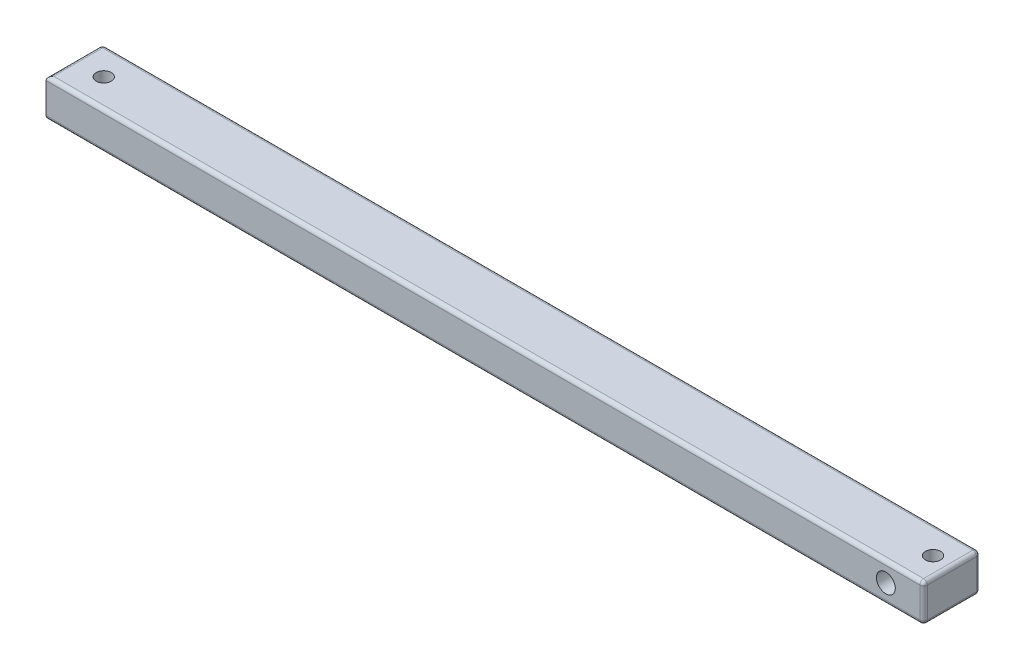
ISO-10303-21;
HEADER;
FILE_DESCRIPTION(('STEP AP214'),'2;1');
FILE_NAME('part.step','',(''),(''),'','','');
FILE_SCHEMA(('AUTOMOTIVE_DESIGN { 1 0 10303 214 1 1 1 1 }'));
ENDSEC;
DATA;
#1=APPLICATION_CONTEXT('core data for automotive mechanical design processes');
#2=APPLICATION_PROTOCOL_DEFINITION('international standard','automotive_design',2000,#1);
#3=PRODUCT_CONTEXT('',#1,'mechanical');
#4=PRODUCT('Part','Part','',(#3));
#5=PRODUCT_RELATED_PRODUCT_CATEGORY('part','',(#4));
#6=PRODUCT_DEFINITION_FORMATION('','',#4);
#7=PRODUCT_DEFINITION_CONTEXT('part definition',#1,'design');
#8=PRODUCT_DEFINITION('design','',#6,#7);
#9=PRODUCT_DEFINITION_SHAPE('','',#8);
#10=(LENGTH_UNIT() NAMED_UNIT(*) SI_UNIT(.MILLI.,.METRE.));
#11=(NAMED_UNIT(*) PLANE_ANGLE_UNIT() SI_UNIT($,.RADIAN.));
#12=(NAMED_UNIT(*) SI_UNIT($,.STERADIAN.) SOLID_ANGLE_UNIT());
#13=UNCERTAINTY_MEASURE_WITH_UNIT(LENGTH_MEASURE(1.E-05),#10,'distance_accuracy_value','');
#14=(GEOMETRIC_REPRESENTATION_CONTEXT(3) GLOBAL_UNCERTAINTY_ASSIGNED_CONTEXT((#13)) GLOBAL_UNIT_ASSIGNED_CONTEXT((#10,
#11,#12)) REPRESENTATION_CONTEXT('',''));
#15=CARTESIAN_POINT('',(0.,0.,0.));
#16=DIRECTION('',(0.,0.,1.));
#17=DIRECTION('',(1.,0.,0.));
#18=AXIS2_PLACEMENT_3D('',#15,#16,#17);
#19=CARTESIAN_POINT('',(-232.5,20.,30.));
#20=DIRECTION('',(1.,0.,0.));
#21=DIRECTION('',(0.,1.,0.));
#22=AXIS2_PLACEMENT_3D('',#19,#20,#21);
#23=PLANE('',#22);
#24=DIRECTION('',(0.,-1.,0.));
#25=VECTOR('',#24,1.);
#26=CARTESIAN_POINT('',(-232.5,20.,30.));
#27=LINE('',#26,#25);
#28=CARTESIAN_POINT('',(-232.5,18.,30.));
#29=VERTEX_POINT('',#28);
#30=CARTESIAN_POINT('',(-232.5,2.,30.));
#31=VERTEX_POINT('',#30);
#32=EDGE_CURVE('E143',#29,#31,#27,.T.);
#33=ORIENTED_EDGE('',*,*,#32,.F.);
#34=DIRECTION('',(0.,0.,-1.));
#35=VECTOR('',#34,1.);
#36=CARTESIAN_POINT('',(-232.5,18.,30.));
#37=LINE('',#36,#35);
#38=CARTESIAN_POINT('',(-232.5,18.,2.));
#39=VERTEX_POINT('',#38);
#40=EDGE_CURVE('E232',#29,#39,#37,.T.);
#41=ORIENTED_EDGE('',*,*,#40,.T.);
#42=DIRECTION('',(0.,-1.,0.));
#43=VECTOR('',#42,1.);
#44=CARTESIAN_POINT('',(-232.5,20.,2.));
#45=LINE('',#44,#43);
#46=CARTESIAN_POINT('',(-232.5,2.,2.));
#47=VERTEX_POINT('',#46);
#48=EDGE_CURVE('E229',#39,#47,#45,.T.);
#49=ORIENTED_EDGE('',*,*,#48,.T.);
#50=DIRECTION('',(0.,0.,-1.));
#51=VECTOR('',#50,1.);
#52=CARTESIAN_POINT('',(-232.5,2.,30.));
#53=LINE('',#52,#51);
#54=EDGE_CURVE('E227',#47,#31,#53,.F.);
#55=ORIENTED_EDGE('',*,*,#54,.T.);
#56=EDGE_LOOP('',(#33,#41,#49,#55));
#57=FACE_BOUND('',#56,.T.);
#58=ADVANCED_FACE('F41',(#57),#23,.F.);
#59=CARTESIAN_POINT('',(-232.5,0.,30.));
#60=DIRECTION('',(0.,1.,0.));
#61=DIRECTION('',(0.,0.,1.));
#62=AXIS2_PLACEMENT_3D('',#59,#60,#61);
#63=PLANE('',#62);
#64=CARTESIAN_POINT('',(222.5,0.,15.));
#65=DIRECTION('',(0.,1.,0.));
#66=DIRECTION('',(0.,0.,1.));
#67=AXIS2_PLACEMENT_3D('',#64,#65,#66);
#68=CIRCLE('',#67,3.99999999999999);
#69=CARTESIAN_POINT('',(222.5,0.,19.));
#70=VERTEX_POINT('',#69);
#71=EDGE_CURVE('E579',#70,#70,#68,.T.);
#72=ORIENTED_EDGE('',*,*,#71,.T.);
#73=EDGE_LOOP('',(#72));
#74=FACE_BOUND('',#73,.T.);
#75=CARTESIAN_POINT('',(-216.9,0.,15.));
#76=DIRECTION('',(0.,1.,0.));
#77=DIRECTION('',(0.,0.,1.));
#78=AXIS2_PLACEMENT_3D('',#75,#76,#77);
#79=CIRCLE('',#78,3.99999999999999);
#80=CARTESIAN_POINT('',(-216.9,0.,19.));
#81=VERTEX_POINT('',#80);
#82=EDGE_CURVE('E240',#81,#81,#79,.T.);
#83=ORIENTED_EDGE('',*,*,#82,.T.);
#84=EDGE_LOOP('',(#83));
#85=FACE_BOUND('',#84,.T.);
#86=DIRECTION('',(0.,0.,-1.));
#87=VECTOR('',#86,1.);
#88=CARTESIAN_POINT('',(-230.5,0.,30.));
#89=LINE('',#88,#87);
#90=CARTESIAN_POINT('',(-230.5,0.,28.));
#91=VERTEX_POINT('',#90);
#92=CARTESIAN_POINT('',(-230.5,0.,2.));
#93=VERTEX_POINT('',#92);
#94=EDGE_CURVE('E132',#91,#93,#89,.T.);
#95=ORIENTED_EDGE('',*,*,#94,.T.);
#96=DIRECTION('',(1.,0.,0.));
#97=VECTOR('',#96,1.);
#98=CARTESIAN_POINT('',(-232.5,0.,2.));
#99=LINE('',#98,#97);
#100=CARTESIAN_POINT('',(230.5,0.,2.));
#101=VERTEX_POINT('',#100);
#102=EDGE_CURVE('E128',#93,#101,#99,.T.);
#103=ORIENTED_EDGE('',*,*,#102,.T.);
#104=DIRECTION('',(0.,0.,-1.));
#105=VECTOR('',#104,1.);
#106=CARTESIAN_POINT('',(230.5,0.,30.));
#107=LINE('',#106,#105);
#108=CARTESIAN_POINT('',(230.5,0.,28.));
#109=VERTEX_POINT('',#108);
#110=EDGE_CURVE('E122',#101,#109,#107,.F.);
#111=ORIENTED_EDGE('',*,*,#110,.T.);
#112=DIRECTION('',(1.,0.,0.));
#113=VECTOR('',#112,1.);
#114=CARTESIAN_POINT('',(-232.5,0.,28.));
#115=LINE('',#114,#113);
#116=EDGE_CURVE('E125',#109,#91,#115,.F.);
#117=ORIENTED_EDGE('',*,*,#116,.T.);
#118=EDGE_LOOP('',(#95,#103,#111,#117));
#119=FACE_BOUND('',#118,.T.);
#120=ADVANCED_FACE('F124',(#74,#85,#119),#63,.F.);
#121=CARTESIAN_POINT('',(232.5,0.,30.));
#122=DIRECTION('',(-1.,0.,0.));
#123=DIRECTION('',(0.,-1.,0.));
#124=AXIS2_PLACEMENT_3D('',#121,#122,#123);
#125=PLANE('',#124);
#126=DIRECTION('',(0.,0.,-1.));
#127=VECTOR('',#126,1.);
#128=CARTESIAN_POINT('',(232.5,2.,30.));
#129=LINE('',#128,#127);
#130=CARTESIAN_POINT('',(232.5,2.,28.));
#131=VERTEX_POINT('',#130);
#132=CARTESIAN_POINT('',(232.5,2.,2.));
#133=VERTEX_POINT('',#132);
#134=EDGE_CURVE('E155',#131,#133,#129,.T.);
#135=ORIENTED_EDGE('',*,*,#134,.T.);
#136=DIRECTION('',(0.,1.,0.));
#137=VECTOR('',#136,1.);
#138=CARTESIAN_POINT('',(232.5,0.,2.));
#139=LINE('',#138,#137);
#140=CARTESIAN_POINT('',(232.5,18.,2.));
#141=VERTEX_POINT('',#140);
#142=EDGE_CURVE('E215',#133,#141,#139,.T.);
#143=ORIENTED_EDGE('',*,*,#142,.T.);
#144=DIRECTION('',(0.,0.,-1.));
#145=VECTOR('',#144,1.);
#146=CARTESIAN_POINT('',(232.5,18.,30.));
#147=LINE('',#146,#145);
#148=CARTESIAN_POINT('',(232.5,18.,28.));
#149=VERTEX_POINT('',#148);
#150=EDGE_CURVE('E213',#141,#149,#147,.F.);
#151=ORIENTED_EDGE('',*,*,#150,.T.);
#152=DIRECTION('',(0.,1.,0.));
#153=VECTOR('',#152,1.);
#154=CARTESIAN_POINT('',(232.5,0.,28.));
#155=LINE('',#154,#153);
#156=EDGE_CURVE('E210',#149,#131,#155,.F.);
#157=ORIENTED_EDGE('',*,*,#156,.T.);
#158=EDGE_LOOP('',(#135,#143,#151,#157));
#159=FACE_BOUND('',#158,.T.);
#160=ADVANCED_FACE('F277',(#159),#125,.F.);
#161=CARTESIAN_POINT('',(232.5,20.,30.));
#162=DIRECTION('',(0.,-1.,0.));
#163=DIRECTION('',(0.,0.,-1.));
#164=AXIS2_PLACEMENT_3D('',#161,#162,#163);
#165=PLANE('',#164);
#166=CARTESIAN_POINT('',(222.5,20.,15.));
#167=DIRECTION('',(0.,1.,0.));
#168=DIRECTION('',(0.,0.,1.));
#169=AXIS2_PLACEMENT_3D('',#166,#167,#168);
#170=CIRCLE('',#169,3.99999999999999);
#171=CARTESIAN_POINT('',(222.5,20.,19.));
#172=VERTEX_POINT('',#171);
#173=EDGE_CURVE('E584',#172,#172,#170,.T.);
#174=ORIENTED_EDGE('',*,*,#173,.F.);
#175=EDGE_LOOP('',(#174));
#176=FACE_BOUND('',#175,.T.);
#177=CARTESIAN_POINT('',(-216.9,20.,15.));
#178=DIRECTION('',(0.,1.,0.));
#179=DIRECTION('',(0.,0.,1.));
#180=AXIS2_PLACEMENT_3D('',#177,#178,#179);
#181=CIRCLE('',#180,3.99999999999999);
#182=CARTESIAN_POINT('',(-216.9,20.,19.));
#183=VERTEX_POINT('',#182);
#184=EDGE_CURVE('E196',#183,#183,#181,.T.);
#185=ORIENTED_EDGE('',*,*,#184,.F.);
#186=EDGE_LOOP('',(#185));
#187=FACE_BOUND('',#186,.T.);
#188=DIRECTION('',(0.,0.,-1.));
#189=VECTOR('',#188,1.);
#190=CARTESIAN_POINT('',(230.5,20.,30.));
#191=LINE('',#190,#189);
#192=CARTESIAN_POINT('',(230.5,20.,28.));
#193=VERTEX_POINT('',#192);
#194=CARTESIAN_POINT('',(230.5,20.,2.));
#195=VERTEX_POINT('',#194);
#196=EDGE_CURVE('E220',#193,#195,#191,.T.);
#197=ORIENTED_EDGE('',*,*,#196,.T.);
#198=DIRECTION('',(-1.,0.,0.));
#199=VECTOR('',#198,1.);
#200=CARTESIAN_POINT('',(232.5,20.,2.));
#201=LINE('',#200,#199);
#202=CARTESIAN_POINT('',(-230.5,20.,2.));
#203=VERTEX_POINT('',#202);
#204=EDGE_CURVE('E224',#195,#203,#201,.T.);
#205=ORIENTED_EDGE('',*,*,#204,.T.);
#206=DIRECTION('',(0.,0.,-1.));
#207=VECTOR('',#206,1.);
#208=CARTESIAN_POINT('',(-230.5,20.,30.));
#209=LINE('',#208,#207);
#210=CARTESIAN_POINT('',(-230.5,20.,28.));
#211=VERTEX_POINT('',#210);
#212=EDGE_CURVE('E222',#203,#211,#209,.F.);
#213=ORIENTED_EDGE('',*,*,#212,.T.);
#214=DIRECTION('',(-1.,0.,0.));
#215=VECTOR('',#214,1.);
#216=CARTESIAN_POINT('',(232.5,20.,28.));
#217=LINE('',#216,#215);
#218=EDGE_CURVE('E218',#211,#193,#217,.F.);
#219=ORIENTED_EDGE('',*,*,#218,.T.);
#220=EDGE_LOOP('',(#197,#205,#213,#219));
#221=FACE_BOUND('',#220,.T.);
#222=ADVANCED_FACE('F289',(#176,#187,#221),#165,.F.);
#223=CARTESIAN_POINT('',(0.,0.,30.));
#224=DIRECTION('',(0.,0.,1.));
#225=DIRECTION('',(1.,0.,0.));
#226=AXIS2_PLACEMENT_3D('',#223,#224,#225);
#227=PLANE('',#226);
#228=CARTESIAN_POINT('',(212.5,10.,30.));
#229=DIRECTION('',(0.,0.,1.));
#230=DIRECTION('',(1.,0.,0.));
#231=AXIS2_PLACEMENT_3D('',#228,#229,#230);
#232=CIRCLE('',#231,4.99999999999999);
#233=CARTESIAN_POINT('',(217.5,10.,30.));
#234=VERTEX_POINT('',#233);
#235=EDGE_CURVE('E576',#234,#234,#232,.T.);
#236=ORIENTED_EDGE('',*,*,#235,.F.);
#237=EDGE_LOOP('',(#236));
#238=FACE_BOUND('',#237,.T.);
#239=ORIENTED_EDGE('',*,*,#32,.T.);
#240=DIRECTION('',(1.,0.,0.));
#241=VECTOR('',#240,1.);
#242=CARTESIAN_POINT('',(232.5,2.,30.));
#243=LINE('',#242,#241);
#244=CARTESIAN_POINT('',(230.5,2.,30.));
#245=VERTEX_POINT('',#244);
#246=EDGE_CURVE('E11',#31,#245,#243,.T.);
#247=ORIENTED_EDGE('',*,*,#246,.T.);
#248=DIRECTION('',(0.,1.,0.));
#249=VECTOR('',#248,1.);
#250=CARTESIAN_POINT('',(230.5,20.,30.));
#251=LINE('',#250,#249);
#252=CARTESIAN_POINT('',(230.5,18.,30.));
#253=VERTEX_POINT('',#252);
#254=EDGE_CURVE('E50',#245,#253,#251,.T.);
#255=ORIENTED_EDGE('',*,*,#254,.T.);
#256=DIRECTION('',(-1.,0.,0.));
#257=VECTOR('',#256,1.);
#258=CARTESIAN_POINT('',(-232.5,18.,30.));
#259=LINE('',#258,#257);
#260=EDGE_CURVE('E234',#253,#29,#259,.T.);
#261=ORIENTED_EDGE('',*,*,#260,.T.);
#262=EDGE_LOOP('',(#239,#247,#255,#261));
#263=FACE_BOUND('',#262,.T.);
#264=ADVANCED_FACE('F299',(#238,#263),#227,.T.);
#265=CARTESIAN_POINT('',(0.,0.,0.));
#266=DIRECTION('',(0.,0.,1.));
#267=DIRECTION('',(1.,0.,0.));
#268=AXIS2_PLACEMENT_3D('',#265,#266,#267);
#269=PLANE('',#268);
#270=CARTESIAN_POINT('',(212.5,10.,0.));
#271=DIRECTION('',(0.,0.,1.));
#272=DIRECTION('',(1.,0.,0.));
#273=AXIS2_PLACEMENT_3D('',#270,#271,#272);
#274=CIRCLE('',#273,4.99999999999999);
#275=CARTESIAN_POINT('',(217.5,10.,0.));
#276=VERTEX_POINT('',#275);
#277=EDGE_CURVE('E578',#276,#276,#274,.T.);
#278=ORIENTED_EDGE('',*,*,#277,.T.);
#279=EDGE_LOOP('',(#278));
#280=FACE_BOUND('',#279,.T.);
#281=DIRECTION('',(0.,1.,0.));
#282=VECTOR('',#281,1.);
#283=CARTESIAN_POINT('',(230.5,3.19883008970123E-13,0.));
#284=LINE('',#283,#282);
#285=CARTESIAN_POINT('',(230.5,18.,0.));
#286=VERTEX_POINT('',#285);
#287=CARTESIAN_POINT('',(230.5,2.,0.));
#288=VERTEX_POINT('',#287);
#289=EDGE_CURVE('E205',#286,#288,#284,.F.);
#290=ORIENTED_EDGE('',*,*,#289,.T.);
#291=DIRECTION('',(1.,0.,0.));
#292=VECTOR('',#291,1.);
#293=CARTESIAN_POINT('',(0.,2.,0.));
#294=LINE('',#293,#292);
#295=CARTESIAN_POINT('',(-230.5,2.,0.));
#296=VERTEX_POINT('',#295);
#297=EDGE_CURVE('E207',#288,#296,#294,.F.);
#298=ORIENTED_EDGE('',*,*,#297,.T.);
#299=DIRECTION('',(0.,-1.,0.));
#300=VECTOR('',#299,1.);
#301=CARTESIAN_POINT('',(-230.5,3.19883008970123E-13,0.));
#302=LINE('',#301,#300);
#303=CARTESIAN_POINT('',(-230.5,18.,0.));
#304=VERTEX_POINT('',#303);
#305=EDGE_CURVE('E201',#296,#304,#302,.F.);
#306=ORIENTED_EDGE('',*,*,#305,.T.);
#307=DIRECTION('',(-1.,0.,0.));
#308=VECTOR('',#307,1.);
#309=CARTESIAN_POINT('',(0.,18.,0.));
#310=LINE('',#309,#308);
#311=EDGE_CURVE('E203',#304,#286,#310,.F.);
#312=ORIENTED_EDGE('',*,*,#311,.T.);
#313=EDGE_LOOP('',(#290,#298,#306,#312));
#314=FACE_BOUND('',#313,.T.);
#315=ADVANCED_FACE('F264',(#280,#314),#269,.F.);
#316=CARTESIAN_POINT('',(0.,18.,28.));
#317=DIRECTION('',(1.,0.,0.));
#318=DIRECTION('',(0.,0.,-1.));
#319=AXIS2_PLACEMENT_3D('',#316,#317,#318);
#320=CYLINDRICAL_SURFACE('',#319,2.);
#321=CARTESIAN_POINT('',(230.5,18.,28.));
#322=DIRECTION('',(1.,0.,0.));
#323=DIRECTION('',(0.,0.,-1.));
#324=AXIS2_PLACEMENT_3D('',#321,#322,#323);
#325=CIRCLE('',#324,2.);
#326=EDGE_CURVE('E45',#193,#253,#325,.T.);
#327=ORIENTED_EDGE('',*,*,#326,.F.);
#328=ORIENTED_EDGE('',*,*,#218,.F.);
#329=CARTESIAN_POINT('',(-230.5,18.,28.));
#330=DIRECTION('',(0.707106781186547,0.,0.707106781186547));
#331=DIRECTION('',(0.707106781186547,0.,-0.707106781186547));
#332=AXIS2_PLACEMENT_3D('',#329,#330,#331);
#333=ELLIPSE('',#332,2.82842712474619,2.);
#334=EDGE_CURVE('E182',#29,#211,#333,.F.);
#335=ORIENTED_EDGE('',*,*,#334,.F.);
#336=ORIENTED_EDGE('',*,*,#260,.F.);
#337=EDGE_LOOP('',(#327,#328,#335,#336));
#338=FACE_BOUND('',#337,.T.);
#339=ADVANCED_FACE('F43',(#338),#320,.T.);
#340=CARTESIAN_POINT('',(230.5,18.,28.));
#341=DIRECTION('',(0.,0.,1.));
#342=DIRECTION('',(1.,0.,0.));
#343=AXIS2_PLACEMENT_3D('',#340,#341,#342);
#344=SPHERICAL_SURFACE('',#343,2.);
#345=CARTESIAN_POINT('',(230.5,18.,28.));
#346=DIRECTION('',(0.,0.,1.));
#347=DIRECTION('',(1.,0.,0.));
#348=AXIS2_PLACEMENT_3D('',#345,#346,#347);
#349=CIRCLE('',#348,2.);
#350=EDGE_CURVE('E177',#193,#149,#349,.F.);
#351=ORIENTED_EDGE('',*,*,#350,.F.);
#352=ORIENTED_EDGE('',*,*,#326,.T.);
#353=CARTESIAN_POINT('',(230.5,18.,28.));
#354=DIRECTION('',(0.,1.,0.));
#355=DIRECTION('',(-1.,0.,0.));
#356=AXIS2_PLACEMENT_3D('',#353,#354,#355);
#357=CIRCLE('',#356,2.);
#358=EDGE_CURVE('E180',#149,#253,#357,.F.);
#359=ORIENTED_EDGE('',*,*,#358,.F.);
#360=EDGE_LOOP('',(#351,#352,#359));
#361=FACE_BOUND('',#360,.T.);
#362=ADVANCED_FACE('F282',(#361),#344,.T.);
#363=CARTESIAN_POINT('',(-230.5,18.,30.));
#364=DIRECTION('',(0.,0.,-1.));
#365=DIRECTION('',(-1.,0.,0.));
#366=AXIS2_PLACEMENT_3D('',#363,#364,#365);
#367=CYLINDRICAL_SURFACE('',#366,2.);
#368=ORIENTED_EDGE('',*,*,#334,.T.);
#369=ORIENTED_EDGE('',*,*,#212,.F.);
#370=CARTESIAN_POINT('',(-230.5,18.,2.));
#371=DIRECTION('',(0.,0.,-1.));
#372=DIRECTION('',(-1.,0.,0.));
#373=AXIS2_PLACEMENT_3D('',#370,#371,#372);
#374=CIRCLE('',#373,2.);
#375=EDGE_CURVE('E152',#39,#203,#374,.T.);
#376=ORIENTED_EDGE('',*,*,#375,.F.);
#377=ORIENTED_EDGE('',*,*,#40,.F.);
#378=EDGE_LOOP('',(#368,#369,#376,#377));
#379=FACE_BOUND('',#378,.T.);
#380=ADVANCED_FACE('F297',(#379),#367,.T.);
#381=CARTESIAN_POINT('',(230.5,3.19883008970123E-13,28.));
#382=DIRECTION('',(0.,-1.,0.));
#383=DIRECTION('',(1.,0.,0.));
#384=AXIS2_PLACEMENT_3D('',#381,#382,#383);
#385=CYLINDRICAL_SURFACE('',#384,2.);
#386=ORIENTED_EDGE('',*,*,#358,.T.);
#387=ORIENTED_EDGE('',*,*,#254,.F.);
#388=CARTESIAN_POINT('',(230.5,2.,28.));
#389=DIRECTION('',(0.,-1.,0.));
#390=DIRECTION('',(1.,0.,0.));
#391=AXIS2_PLACEMENT_3D('',#388,#389,#390);
#392=CIRCLE('',#391,2.);
#393=EDGE_CURVE('E151',#131,#245,#392,.T.);
#394=ORIENTED_EDGE('',*,*,#393,.F.);
#395=ORIENTED_EDGE('',*,*,#156,.F.);
#396=EDGE_LOOP('',(#386,#387,#394,#395));
#397=FACE_BOUND('',#396,.T.);
#398=ADVANCED_FACE('F281',(#397),#385,.T.);
#399=CARTESIAN_POINT('',(230.5,18.,30.));
#400=DIRECTION('',(0.,0.,-1.));
#401=DIRECTION('',(-1.,0.,0.));
#402=AXIS2_PLACEMENT_3D('',#399,#400,#401);
#403=CYLINDRICAL_SURFACE('',#402,2.);
#404=ORIENTED_EDGE('',*,*,#350,.T.);
#405=ORIENTED_EDGE('',*,*,#150,.F.);
#406=CARTESIAN_POINT('',(230.5,18.,2.));
#407=DIRECTION('',(0.,0.,-1.));
#408=DIRECTION('',(-1.,0.,0.));
#409=AXIS2_PLACEMENT_3D('',#406,#407,#408);
#410=CIRCLE('',#409,2.);
#411=EDGE_CURVE('E169',#195,#141,#410,.T.);
#412=ORIENTED_EDGE('',*,*,#411,.F.);
#413=ORIENTED_EDGE('',*,*,#196,.F.);
#414=EDGE_LOOP('',(#404,#405,#412,#413));
#415=FACE_BOUND('',#414,.T.);
#416=ADVANCED_FACE('F286',(#415),#403,.T.);
#417=CARTESIAN_POINT('',(232.5,18.,2.));
#418=DIRECTION('',(-1.,0.,0.));
#419=DIRECTION('',(0.,0.,1.));
#420=AXIS2_PLACEMENT_3D('',#417,#418,#419);
#421=CYLINDRICAL_SURFACE('',#420,2.);
#422=CARTESIAN_POINT('',(-230.5,18.,2.));
#423=DIRECTION('',(-1.,0.,0.));
#424=DIRECTION('',(0.,0.,1.));
#425=AXIS2_PLACEMENT_3D('',#422,#423,#424);
#426=CIRCLE('',#425,2.);
#427=EDGE_CURVE('E174',#203,#304,#426,.T.);
#428=ORIENTED_EDGE('',*,*,#427,.F.);
#429=ORIENTED_EDGE('',*,*,#204,.F.);
#430=CARTESIAN_POINT('',(230.5,18.,2.));
#431=DIRECTION('',(1.,0.,0.));
#432=DIRECTION('',(0.,0.,-1.));
#433=AXIS2_PLACEMENT_3D('',#430,#431,#432);
#434=CIRCLE('',#433,2.);
#435=EDGE_CURVE('E166',#286,#195,#434,.T.);
#436=ORIENTED_EDGE('',*,*,#435,.F.);
#437=ORIENTED_EDGE('',*,*,#311,.F.);
#438=EDGE_LOOP('',(#428,#429,#436,#437));
#439=FACE_BOUND('',#438,.T.);
#440=ADVANCED_FACE('F294',(#439),#421,.T.);
#441=CARTESIAN_POINT('',(-230.5,18.,2.));
#442=DIRECTION('',(0.,1.,0.));
#443=DIRECTION('',(0.,0.,1.));
#444=AXIS2_PLACEMENT_3D('',#441,#442,#443);
#445=SPHERICAL_SURFACE('',#444,2.);
#446=ORIENTED_EDGE('',*,*,#375,.T.);
#447=ORIENTED_EDGE('',*,*,#427,.T.);
#448=CARTESIAN_POINT('',(-230.5,18.,2.));
#449=DIRECTION('',(0.,1.,0.));
#450=DIRECTION('',(-1.,0.,0.));
#451=AXIS2_PLACEMENT_3D('',#448,#449,#450);
#452=CIRCLE('',#451,2.);
#453=EDGE_CURVE('E158',#39,#304,#452,.F.);
#454=ORIENTED_EDGE('',*,*,#453,.F.);
#455=EDGE_LOOP('',(#446,#447,#454));
#456=FACE_BOUND('',#455,.T.);
#457=ADVANCED_FACE('F454',(#456),#445,.T.);
#458=CARTESIAN_POINT('',(0.,2.,28.));
#459=DIRECTION('',(-1.,0.,0.));
#460=DIRECTION('',(0.,0.,1.));
#461=AXIS2_PLACEMENT_3D('',#458,#459,#460);
#462=CYLINDRICAL_SURFACE('',#461,2.);
#463=CARTESIAN_POINT('',(230.5,2.,28.));
#464=DIRECTION('',(1.,0.,0.));
#465=DIRECTION('',(0.,0.,-1.));
#466=AXIS2_PLACEMENT_3D('',#463,#464,#465);
#467=CIRCLE('',#466,2.);
#468=EDGE_CURVE('E138',#245,#109,#467,.T.);
#469=ORIENTED_EDGE('',*,*,#468,.F.);
#470=ORIENTED_EDGE('',*,*,#246,.F.);
#471=CARTESIAN_POINT('',(-230.5,2.,28.));
#472=DIRECTION('',(-0.707106781186547,0.,-0.707106781186547));
#473=DIRECTION('',(-0.707106781186547,0.,0.707106781186547));
#474=AXIS2_PLACEMENT_3D('',#471,#472,#473);
#475=ELLIPSE('',#474,2.82842712474619,2.);
#476=EDGE_CURVE('E141',#91,#31,#475,.T.);
#477=ORIENTED_EDGE('',*,*,#476,.F.);
#478=ORIENTED_EDGE('',*,*,#116,.F.);
#479=EDGE_LOOP('',(#469,#470,#477,#478));
#480=FACE_BOUND('',#479,.T.);
#481=ADVANCED_FACE('F137',(#480),#462,.T.);
#482=CARTESIAN_POINT('',(230.5,2.,28.));
#483=DIRECTION('',(0.,0.,1.));
#484=DIRECTION('',(1.,0.,0.));
#485=AXIS2_PLACEMENT_3D('',#482,#483,#484);
#486=SPHERICAL_SURFACE('',#485,2.);
#487=ORIENTED_EDGE('',*,*,#393,.T.);
#488=ORIENTED_EDGE('',*,*,#468,.T.);
#489=CARTESIAN_POINT('',(230.5,2.,28.));
#490=DIRECTION('',(0.,0.,1.));
#491=DIRECTION('',(1.,0.,0.));
#492=AXIS2_PLACEMENT_3D('',#489,#490,#491);
#493=CIRCLE('',#492,2.);
#494=EDGE_CURVE('E148',#131,#109,#493,.F.);
#495=ORIENTED_EDGE('',*,*,#494,.F.);
#496=EDGE_LOOP('',(#487,#488,#495));
#497=FACE_BOUND('',#496,.T.);
#498=ADVANCED_FACE('F147',(#497),#486,.T.);
#499=CARTESIAN_POINT('',(230.5,18.,2.));
#500=DIRECTION('',(0.,1.,0.));
#501=DIRECTION('',(0.,0.,1.));
#502=AXIS2_PLACEMENT_3D('',#499,#500,#501);
#503=SPHERICAL_SURFACE('',#502,2.);
#504=ORIENTED_EDGE('',*,*,#435,.T.);
#505=ORIENTED_EDGE('',*,*,#411,.T.);
#506=CARTESIAN_POINT('',(230.5,18.,2.));
#507=DIRECTION('',(0.,1.,0.));
#508=DIRECTION('',(-1.,0.,0.));
#509=AXIS2_PLACEMENT_3D('',#506,#507,#508);
#510=CIRCLE('',#509,2.);
#511=EDGE_CURVE('E156',#286,#141,#510,.F.);
#512=ORIENTED_EDGE('',*,*,#511,.F.);
#513=EDGE_LOOP('',(#504,#505,#512));
#514=FACE_BOUND('',#513,.T.);
#515=ADVANCED_FACE('F310',(#514),#503,.T.);
#516=CARTESIAN_POINT('',(-230.5,20.,2.));
#517=DIRECTION('',(0.,-1.,0.));
#518=DIRECTION('',(1.,0.,0.));
#519=AXIS2_PLACEMENT_3D('',#516,#517,#518);
#520=CYLINDRICAL_SURFACE('',#519,2.);
#521=ORIENTED_EDGE('',*,*,#453,.T.);
#522=ORIENTED_EDGE('',*,*,#305,.F.);
#523=CARTESIAN_POINT('',(-230.5,2.,2.));
#524=DIRECTION('',(0.,-1.,0.));
#525=DIRECTION('',(1.,0.,0.));
#526=AXIS2_PLACEMENT_3D('',#523,#524,#525);
#527=CIRCLE('',#526,2.);
#528=EDGE_CURVE('E160',#47,#296,#527,.T.);
#529=ORIENTED_EDGE('',*,*,#528,.F.);
#530=ORIENTED_EDGE('',*,*,#48,.F.);
#531=EDGE_LOOP('',(#521,#522,#529,#530));
#532=FACE_BOUND('',#531,.T.);
#533=ADVANCED_FACE('F259',(#532),#520,.T.);
#534=CARTESIAN_POINT('',(-230.5,2.,30.));
#535=DIRECTION('',(0.,0.,-1.));
#536=DIRECTION('',(-1.,0.,0.));
#537=AXIS2_PLACEMENT_3D('',#534,#535,#536);
#538=CYLINDRICAL_SURFACE('',#537,2.);
#539=ORIENTED_EDGE('',*,*,#476,.T.);
#540=ORIENTED_EDGE('',*,*,#54,.F.);
#541=CARTESIAN_POINT('',(-230.5,2.,2.));
#542=DIRECTION('',(0.,0.,-1.));
#543=DIRECTION('',(-1.,0.,0.));
#544=AXIS2_PLACEMENT_3D('',#541,#542,#543);
#545=CIRCLE('',#544,2.);
#546=EDGE_CURVE('E248',#93,#47,#545,.T.);
#547=ORIENTED_EDGE('',*,*,#546,.F.);
#548=ORIENTED_EDGE('',*,*,#94,.F.);
#549=EDGE_LOOP('',(#539,#540,#547,#548));
#550=FACE_BOUND('',#549,.T.);
#551=ADVANCED_FACE('F302',(#550),#538,.T.);
#552=CARTESIAN_POINT('',(230.5,2.,30.));
#553=DIRECTION('',(0.,0.,-1.));
#554=DIRECTION('',(-1.,0.,0.));
#555=AXIS2_PLACEMENT_3D('',#552,#553,#554);
#556=CYLINDRICAL_SURFACE('',#555,2.);
#557=ORIENTED_EDGE('',*,*,#494,.T.);
#558=ORIENTED_EDGE('',*,*,#110,.F.);
#559=CARTESIAN_POINT('',(230.5,2.,2.));
#560=DIRECTION('',(0.,0.,-1.));
#561=DIRECTION('',(-1.,0.,0.));
#562=AXIS2_PLACEMENT_3D('',#559,#560,#561);
#563=CIRCLE('',#562,2.);
#564=EDGE_CURVE('E245',#133,#101,#563,.T.);
#565=ORIENTED_EDGE('',*,*,#564,.F.);
#566=ORIENTED_EDGE('',*,*,#134,.F.);
#567=EDGE_LOOP('',(#557,#558,#565,#566));
#568=FACE_BOUND('',#567,.T.);
#569=ADVANCED_FACE('F154',(#568),#556,.T.);
#570=CARTESIAN_POINT('',(230.5,0.,2.));
#571=DIRECTION('',(0.,1.,0.));
#572=DIRECTION('',(-1.,0.,0.));
#573=AXIS2_PLACEMENT_3D('',#570,#571,#572);
#574=CYLINDRICAL_SURFACE('',#573,2.);
#575=ORIENTED_EDGE('',*,*,#511,.T.);
#576=ORIENTED_EDGE('',*,*,#142,.F.);
#577=CARTESIAN_POINT('',(230.5,2.,2.));
#578=DIRECTION('',(0.,-1.,0.));
#579=DIRECTION('',(1.,0.,0.));
#580=AXIS2_PLACEMENT_3D('',#577,#578,#579);
#581=CIRCLE('',#580,2.);
#582=EDGE_CURVE('E242',#288,#133,#581,.T.);
#583=ORIENTED_EDGE('',*,*,#582,.F.);
#584=ORIENTED_EDGE('',*,*,#289,.F.);
#585=EDGE_LOOP('',(#575,#576,#583,#584));
#586=FACE_BOUND('',#585,.T.);
#587=ADVANCED_FACE('F274',(#586),#574,.T.);
#588=CARTESIAN_POINT('',(-230.5,2.,2.));
#589=DIRECTION('',(-1.,0.,0.));
#590=DIRECTION('',(0.,-1.,0.));
#591=AXIS2_PLACEMENT_3D('',#588,#589,#590);
#592=SPHERICAL_SURFACE('',#591,2.);
#593=ORIENTED_EDGE('',*,*,#546,.T.);
#594=ORIENTED_EDGE('',*,*,#528,.T.);
#595=CARTESIAN_POINT('',(-230.5,2.,2.));
#596=DIRECTION('',(-1.,0.,0.));
#597=DIRECTION('',(0.,0.,1.));
#598=AXIS2_PLACEMENT_3D('',#595,#596,#597);
#599=CIRCLE('',#598,2.);
#600=EDGE_CURVE('E239',#93,#296,#599,.F.);
#601=ORIENTED_EDGE('',*,*,#600,.F.);
#602=EDGE_LOOP('',(#593,#594,#601));
#603=FACE_BOUND('',#602,.T.);
#604=ADVANCED_FACE('F254',(#603),#592,.T.);
#605=CARTESIAN_POINT('',(230.5,2.,2.));
#606=DIRECTION('',(1.,0.,0.));
#607=DIRECTION('',(0.,1.,0.));
#608=AXIS2_PLACEMENT_3D('',#605,#606,#607);
#609=SPHERICAL_SURFACE('',#608,2.);
#610=ORIENTED_EDGE('',*,*,#582,.T.);
#611=ORIENTED_EDGE('',*,*,#564,.T.);
#612=CARTESIAN_POINT('',(230.5,2.,2.));
#613=DIRECTION('',(1.,0.,0.));
#614=DIRECTION('',(0.,0.,-1.));
#615=AXIS2_PLACEMENT_3D('',#612,#613,#614);
#616=CIRCLE('',#615,2.);
#617=EDGE_CURVE('E237',#288,#101,#616,.F.);
#618=ORIENTED_EDGE('',*,*,#617,.F.);
#619=EDGE_LOOP('',(#610,#611,#618));
#620=FACE_BOUND('',#619,.T.);
#621=ADVANCED_FACE('F271',(#620),#609,.T.);
#622=CARTESIAN_POINT('',(-232.5,2.,2.));
#623=DIRECTION('',(1.,0.,0.));
#624=DIRECTION('',(0.,0.,-1.));
#625=AXIS2_PLACEMENT_3D('',#622,#623,#624);
#626=CYLINDRICAL_SURFACE('',#625,2.);
#627=ORIENTED_EDGE('',*,*,#600,.T.);
#628=ORIENTED_EDGE('',*,*,#297,.F.);
#629=ORIENTED_EDGE('',*,*,#617,.T.);
#630=ORIENTED_EDGE('',*,*,#102,.F.);
#631=EDGE_LOOP('',(#627,#628,#629,#630));
#632=FACE_BOUND('',#631,.T.);
#633=ADVANCED_FACE('F269',(#632),#626,.T.);
#634=CARTESIAN_POINT('',(-216.9,0.,15.));
#635=DIRECTION('',(0.,1.,0.));
#636=DIRECTION('',(0.,0.,1.));
#637=AXIS2_PLACEMENT_3D('',#634,#635,#636);
#638=CYLINDRICAL_SURFACE('',#637,3.99999999999999);
#639=ORIENTED_EDGE('',*,*,#82,.F.);
#640=EDGE_LOOP('',(#639));
#641=FACE_BOUND('',#640,.T.);
#642=ORIENTED_EDGE('',*,*,#184,.T.);
#643=EDGE_LOOP('',(#642));
#644=FACE_BOUND('',#643,.T.);
#645=ADVANCED_FACE('F323',(#641,#644),#638,.F.);
#646=CARTESIAN_POINT('',(212.5,10.,0.));
#647=DIRECTION('',(0.,0.,1.));
#648=DIRECTION('',(1.,0.,0.));
#649=AXIS2_PLACEMENT_3D('',#646,#647,#648);
#650=CYLINDRICAL_SURFACE('',#649,4.99999999999999);
#651=ORIENTED_EDGE('',*,*,#277,.F.);
#652=EDGE_LOOP('',(#651));
#653=FACE_BOUND('',#652,.T.);
#654=ORIENTED_EDGE('',*,*,#235,.T.);
#655=EDGE_LOOP('',(#654));
#656=FACE_BOUND('',#655,.T.);
#657=ADVANCED_FACE('F351',(#653,#656),#650,.F.);
#658=CARTESIAN_POINT('',(222.5,0.,15.));
#659=DIRECTION('',(0.,1.,0.));
#660=DIRECTION('',(0.,0.,1.));
#661=AXIS2_PLACEMENT_3D('',#658,#659,#660);
#662=CYLINDRICAL_SURFACE('',#661,3.99999999999999);
#663=ORIENTED_EDGE('',*,*,#71,.F.);
#664=EDGE_LOOP('',(#663));
#665=FACE_BOUND('',#664,.T.);
#666=ORIENTED_EDGE('',*,*,#173,.T.);
#667=EDGE_LOOP('',(#666));
#668=FACE_BOUND('',#667,.T.);
#669=ADVANCED_FACE('F360',(#665,#668),#662,.F.);
#670=CLOSED_SHELL('',(#58,#120,#160,#222,#264,#315,#339,#362,#380,#398,#416,#440,#457,#481,#498,
#515,#533,#551,#569,#587,#604,#621,#633,#645,#657,#669));
#671=MANIFOLD_SOLID_BREP('B2',#670);
#672=ADVANCED_BREP_SHAPE_REPRESENTATION('',(#18,#671),#14);
#673=SHAPE_DEFINITION_REPRESENTATION(#9,#672);
ENDSEC;
END-ISO-10303-21;
